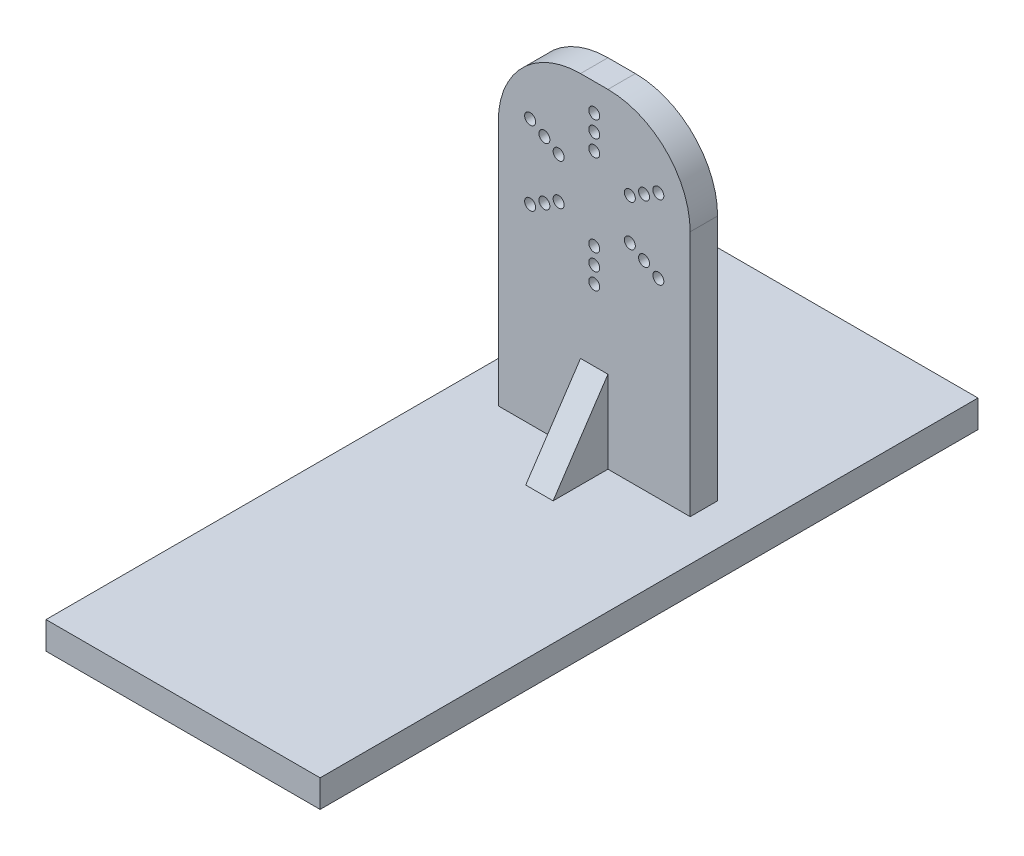
ISO-10303-21;
HEADER;
FILE_DESCRIPTION(('STEP AP214'),'2;1');
FILE_NAME('part.step','',(''),(''),'','','');
FILE_SCHEMA(('AUTOMOTIVE_DESIGN { 1 0 10303 214 1 1 1 1 }'));
ENDSEC;
DATA;
#1=APPLICATION_CONTEXT('core data for automotive mechanical design processes');
#2=APPLICATION_PROTOCOL_DEFINITION('international standard','automotive_design',2000,#1);
#3=PRODUCT_CONTEXT('',#1,'mechanical');
#4=PRODUCT('Part','Part','',(#3));
#5=PRODUCT_RELATED_PRODUCT_CATEGORY('part','',(#4));
#6=PRODUCT_DEFINITION_FORMATION('','',#4);
#7=PRODUCT_DEFINITION_CONTEXT('part definition',#1,'design');
#8=PRODUCT_DEFINITION('design','',#6,#7);
#9=PRODUCT_DEFINITION_SHAPE('','',#8);
#10=(LENGTH_UNIT() NAMED_UNIT(*) SI_UNIT(.MILLI.,.METRE.));
#11=(NAMED_UNIT(*) PLANE_ANGLE_UNIT() SI_UNIT($,.RADIAN.));
#12=(NAMED_UNIT(*) SI_UNIT($,.STERADIAN.) SOLID_ANGLE_UNIT());
#13=UNCERTAINTY_MEASURE_WITH_UNIT(LENGTH_MEASURE(1.E-05),#10,'distance_accuracy_value','');
#14=(GEOMETRIC_REPRESENTATION_CONTEXT(3) GLOBAL_UNCERTAINTY_ASSIGNED_CONTEXT((#13)) GLOBAL_UNIT_ASSIGNED_CONTEXT((#10,
#11,#12)) REPRESENTATION_CONTEXT('',''));
#15=CARTESIAN_POINT('',(0.,0.,0.));
#16=DIRECTION('',(0.,0.,1.));
#17=DIRECTION('',(1.,0.,0.));
#18=AXIS2_PLACEMENT_3D('',#15,#16,#17);
#19=CARTESIAN_POINT('',(17.5,-30.,2.5));
#20=DIRECTION('',(-1.,0.,0.));
#21=DIRECTION('',(0.,0.,1.));
#22=AXIS2_PLACEMENT_3D('',#19,#20,#21);
#23=PLANE('',#22);
#24=DIRECTION('',(0.,1.,0.));
#25=VECTOR('',#24,1.);
#26=CARTESIAN_POINT('',(17.5,-30.,-2.5));
#27=LINE('',#26,#25);
#28=CARTESIAN_POINT('',(17.5,-30.,-2.5));
#29=VERTEX_POINT('',#28);
#30=CARTESIAN_POINT('',(17.5,15.,-2.5));
#31=VERTEX_POINT('',#30);
#32=EDGE_CURVE('E181',#29,#31,#27,.T.);
#33=ORIENTED_EDGE('',*,*,#32,.T.);
#34=DIRECTION('',(0.,0.,-1.));
#35=VECTOR('',#34,1.);
#36=CARTESIAN_POINT('',(17.5,15.,2.5));
#37=LINE('',#36,#35);
#38=CARTESIAN_POINT('',(17.5,15.,2.5));
#39=VERTEX_POINT('',#38);
#40=EDGE_CURVE('E433',#31,#39,#37,.F.);
#41=ORIENTED_EDGE('',*,*,#40,.T.);
#42=DIRECTION('',(0.,1.,0.));
#43=VECTOR('',#42,1.);
#44=CARTESIAN_POINT('',(17.5,-30.,2.5));
#45=LINE('',#44,#43);
#46=CARTESIAN_POINT('',(17.5,-30.,2.5));
#47=VERTEX_POINT('',#46);
#48=EDGE_CURVE('E387',#47,#39,#45,.T.);
#49=ORIENTED_EDGE('',*,*,#48,.F.);
#50=DIRECTION('',(0.,0.,-1.));
#51=VECTOR('',#50,1.);
#52=CARTESIAN_POINT('',(17.5,-30.,2.5));
#53=LINE('',#52,#51);
#54=EDGE_CURVE('E404',#47,#29,#53,.T.);
#55=ORIENTED_EDGE('',*,*,#54,.T.);
#56=EDGE_LOOP('',(#33,#41,#49,#55));
#57=FACE_BOUND('',#56,.T.);
#58=ADVANCED_FACE('F39',(#57),#23,.F.);
#59=CARTESIAN_POINT('',(-17.5,30.,2.5));
#60=DIRECTION('',(0.,-1.,0.));
#61=DIRECTION('',(0.,0.,-1.));
#62=AXIS2_PLACEMENT_3D('',#59,#60,#61);
#63=PLANE('',#62);
#64=DIRECTION('',(-1.,0.,0.));
#65=VECTOR('',#64,1.);
#66=CARTESIAN_POINT('',(-17.5,30.,2.5));
#67=LINE('',#66,#65);
#68=CARTESIAN_POINT('',(2.5,30.,2.5));
#69=VERTEX_POINT('',#68);
#70=CARTESIAN_POINT('',(-2.50000000000001,30.,2.5));
#71=VERTEX_POINT('',#70);
#72=EDGE_CURVE('E391',#69,#71,#67,.T.);
#73=ORIENTED_EDGE('',*,*,#72,.F.);
#74=DIRECTION('',(0.,0.,-1.));
#75=VECTOR('',#74,1.);
#76=CARTESIAN_POINT('',(2.5,30.,2.5));
#77=LINE('',#76,#75);
#78=CARTESIAN_POINT('',(2.5,30.,-2.5));
#79=VERTEX_POINT('',#78);
#80=EDGE_CURVE('E423',#69,#79,#77,.T.);
#81=ORIENTED_EDGE('',*,*,#80,.T.);
#82=DIRECTION('',(-1.,0.,0.));
#83=VECTOR('',#82,1.);
#84=CARTESIAN_POINT('',(-17.5,30.,-2.5));
#85=LINE('',#84,#83);
#86=CARTESIAN_POINT('',(-2.50000000000001,30.,-2.5));
#87=VERTEX_POINT('',#86);
#88=EDGE_CURVE('E407',#79,#87,#85,.T.);
#89=ORIENTED_EDGE('',*,*,#88,.T.);
#90=DIRECTION('',(0.,0.,-1.));
#91=VECTOR('',#90,1.);
#92=CARTESIAN_POINT('',(-2.50000000000001,30.,2.5));
#93=LINE('',#92,#91);
#94=EDGE_CURVE('E420',#87,#71,#93,.F.);
#95=ORIENTED_EDGE('',*,*,#94,.T.);
#96=EDGE_LOOP('',(#73,#81,#89,#95));
#97=FACE_BOUND('',#96,.T.);
#98=ADVANCED_FACE('F450',(#97),#63,.F.);
#99=CARTESIAN_POINT('',(-17.5,-30.,2.5));
#100=DIRECTION('',(1.,0.,0.));
#101=DIRECTION('',(0.,0.,-1.));
#102=AXIS2_PLACEMENT_3D('',#99,#100,#101);
#103=PLANE('',#102);
#104=DIRECTION('',(0.,-1.,0.));
#105=VECTOR('',#104,1.);
#106=CARTESIAN_POINT('',(-17.5,-30.,2.5));
#107=LINE('',#106,#105);
#108=CARTESIAN_POINT('',(-17.5,15.,2.5));
#109=VERTEX_POINT('',#108);
#110=CARTESIAN_POINT('',(-17.5,-30.,2.5));
#111=VERTEX_POINT('',#110);
#112=EDGE_CURVE('E396',#109,#111,#107,.T.);
#113=ORIENTED_EDGE('',*,*,#112,.F.);
#114=DIRECTION('',(0.,0.,-1.));
#115=VECTOR('',#114,1.);
#116=CARTESIAN_POINT('',(-17.5,15.,2.5));
#117=LINE('',#116,#115);
#118=CARTESIAN_POINT('',(-17.5,15.,-2.5));
#119=VERTEX_POINT('',#118);
#120=EDGE_CURVE('E43',#109,#119,#117,.T.);
#121=ORIENTED_EDGE('',*,*,#120,.T.);
#122=DIRECTION('',(0.,-1.,0.));
#123=VECTOR('',#122,1.);
#124=CARTESIAN_POINT('',(-17.5,-30.,-2.5));
#125=LINE('',#124,#123);
#126=CARTESIAN_POINT('',(-17.5,-30.,-2.5));
#127=VERTEX_POINT('',#126);
#128=EDGE_CURVE('E392',#119,#127,#125,.T.);
#129=ORIENTED_EDGE('',*,*,#128,.T.);
#130=DIRECTION('',(0.,0.,-1.));
#131=VECTOR('',#130,1.);
#132=CARTESIAN_POINT('',(-17.5,-30.,2.5));
#133=LINE('',#132,#131);
#134=EDGE_CURVE('E416',#111,#127,#133,.T.);
#135=ORIENTED_EDGE('',*,*,#134,.F.);
#136=EDGE_LOOP('',(#113,#121,#129,#135));
#137=FACE_BOUND('',#136,.T.);
#138=ADVANCED_FACE('F493',(#137),#103,.F.);
#139=CARTESIAN_POINT('',(0.,0.,2.5));
#140=DIRECTION('',(0.,0.,-1.));
#141=DIRECTION('',(-1.,0.,0.));
#142=AXIS2_PLACEMENT_3D('',#139,#140,#141);
#143=PLANE('',#142);
#144=CARTESIAN_POINT('',(0.,25.,2.5));
#145=DIRECTION('',(0.,0.,-1.));
#146=DIRECTION('',(-1.,0.,0.));
#147=AXIS2_PLACEMENT_3D('',#144,#145,#146);
#148=CIRCLE('',#147,1.);
#149=CARTESIAN_POINT('',(-0.999999999999929,25.,2.5));
#150=VERTEX_POINT('',#149);
#151=EDGE_CURVE('E248',#150,#150,#148,.F.);
#152=ORIENTED_EDGE('',*,*,#151,.F.);
#153=EDGE_LOOP('',(#152));
#154=FACE_BOUND('',#153,.T.);
#155=CARTESIAN_POINT('',(6.49519052838326,15.25,2.5));
#156=DIRECTION('',(0.,0.,-1.));
#157=DIRECTION('',(-1.,0.,0.));
#158=AXIS2_PLACEMENT_3D('',#155,#156,#157);
#159=CIRCLE('',#158,1.);
#160=CARTESIAN_POINT('',(5.49519052838326,15.25,2.5));
#161=VERTEX_POINT('',#160);
#162=EDGE_CURVE('E256',#161,#161,#159,.F.);
#163=ORIENTED_EDGE('',*,*,#162,.F.);
#164=EDGE_LOOP('',(#163));
#165=FACE_BOUND('',#164,.T.);
#166=CARTESIAN_POINT('',(-6.49519052838332,15.2499999999999,2.5));
#167=DIRECTION('',(0.,0.,-1.));
#168=DIRECTION('',(-1.,0.,0.));
#169=AXIS2_PLACEMENT_3D('',#166,#167,#168);
#170=CIRCLE('',#169,1.);
#171=CARTESIAN_POINT('',(-7.49519052838332,15.2499999999999,2.5));
#172=VERTEX_POINT('',#171);
#173=EDGE_CURVE('E345',#172,#172,#170,.F.);
#174=ORIENTED_EDGE('',*,*,#173,.F.);
#175=EDGE_LOOP('',(#174));
#176=FACE_BOUND('',#175,.T.);
#177=CARTESIAN_POINT('',(-11.6913429510899,4.75,2.5));
#178=DIRECTION('',(0.,0.,-1.));
#179=DIRECTION('',(-1.,0.,0.));
#180=AXIS2_PLACEMENT_3D('',#177,#178,#179);
#181=CIRCLE('',#180,0.999999999999998);
#182=CARTESIAN_POINT('',(-12.6913429510899,4.75,2.5));
#183=VERTEX_POINT('',#182);
#184=EDGE_CURVE('E346',#183,#183,#181,.F.);
#185=ORIENTED_EDGE('',*,*,#184,.F.);
#186=EDGE_LOOP('',(#185));
#187=FACE_BOUND('',#186,.T.);
#188=CARTESIAN_POINT('',(-9.09326673973659,6.24999999999997,2.5));
#189=DIRECTION('',(0.,0.,-1.));
#190=DIRECTION('',(-1.,0.,0.));
#191=AXIS2_PLACEMENT_3D('',#188,#189,#190);
#192=CIRCLE('',#191,1.);
#193=CARTESIAN_POINT('',(-10.0932667397366,6.24999999999997,2.5));
#194=VERTEX_POINT('',#193);
#195=EDGE_CURVE('E329',#194,#194,#192,.F.);
#196=ORIENTED_EDGE('',*,*,#195,.F.);
#197=EDGE_LOOP('',(#196));
#198=FACE_BOUND('',#197,.T.);
#199=CARTESIAN_POINT('',(-6.49519052838326,7.74999999999994,2.5));
#200=DIRECTION('',(0.,0.,-1.));
#201=DIRECTION('',(-1.,0.,0.));
#202=AXIS2_PLACEMENT_3D('',#199,#200,#201);
#203=CIRCLE('',#202,1.);
#204=CARTESIAN_POINT('',(-7.49519052838326,7.74999999999994,2.5));
#205=VERTEX_POINT('',#204);
#206=EDGE_CURVE('E330',#205,#205,#203,.F.);
#207=ORIENTED_EDGE('',*,*,#206,.F.);
#208=EDGE_LOOP('',(#207));
#209=FACE_BOUND('',#208,.T.);
#210=CARTESIAN_POINT('',(-9.09326673973663,16.75,2.5));
#211=DIRECTION('',(0.,0.,-1.));
#212=DIRECTION('',(-1.,0.,0.));
#213=AXIS2_PLACEMENT_3D('',#210,#211,#212);
#214=CIRCLE('',#213,1.);
#215=CARTESIAN_POINT('',(-10.0932667397366,16.75,2.5));
#216=VERTEX_POINT('',#215);
#217=EDGE_CURVE('E377',#216,#216,#214,.F.);
#218=ORIENTED_EDGE('',*,*,#217,.F.);
#219=EDGE_LOOP('',(#218));
#220=FACE_BOUND('',#219,.T.);
#221=CARTESIAN_POINT('',(-11.6913429510899,18.25,2.5));
#222=DIRECTION('',(0.,0.,-1.));
#223=DIRECTION('',(-1.,0.,0.));
#224=AXIS2_PLACEMENT_3D('',#221,#222,#223);
#225=CIRCLE('',#224,1.);
#226=CARTESIAN_POINT('',(-12.6913429510899,18.25,2.5));
#227=VERTEX_POINT('',#226);
#228=EDGE_CURVE('E369',#227,#227,#225,.F.);
#229=ORIENTED_EDGE('',*,*,#228,.F.);
#230=EDGE_LOOP('',(#229));
#231=FACE_BOUND('',#230,.T.);
#232=CARTESIAN_POINT('',(0.,19.,2.5));
#233=DIRECTION('',(0.,0.,-1.));
#234=DIRECTION('',(-1.,0.,0.));
#235=AXIS2_PLACEMENT_3D('',#232,#233,#234);
#236=CIRCLE('',#235,1.);
#237=CARTESIAN_POINT('',(-1.00000000000006,19.,2.5));
#238=VERTEX_POINT('',#237);
#239=EDGE_CURVE('E361',#238,#238,#236,.F.);
#240=ORIENTED_EDGE('',*,*,#239,.F.);
#241=EDGE_LOOP('',(#240));
#242=FACE_BOUND('',#241,.T.);
#243=CARTESIAN_POINT('',(0.,22.,2.5));
#244=DIRECTION('',(0.,0.,-1.));
#245=DIRECTION('',(-1.,0.,0.));
#246=AXIS2_PLACEMENT_3D('',#243,#244,#245);
#247=CIRCLE('',#246,1.);
#248=CARTESIAN_POINT('',(-1.00000000000003,22.,2.5));
#249=VERTEX_POINT('',#248);
#250=EDGE_CURVE('E249',#249,#249,#247,.F.);
#251=ORIENTED_EDGE('',*,*,#250,.F.);
#252=EDGE_LOOP('',(#251));
#253=FACE_BOUND('',#252,.T.);
#254=CARTESIAN_POINT('',(9.0932667397366,16.75,2.5));
#255=DIRECTION('',(0.,0.,-1.));
#256=DIRECTION('',(-1.,0.,0.));
#257=AXIS2_PLACEMENT_3D('',#254,#255,#256);
#258=CIRCLE('',#257,1.);
#259=CARTESIAN_POINT('',(8.09326673973659,16.75,2.5));
#260=VERTEX_POINT('',#259);
#261=EDGE_CURVE('E283',#260,#260,#258,.F.);
#262=ORIENTED_EDGE('',*,*,#261,.F.);
#263=EDGE_LOOP('',(#262));
#264=FACE_BOUND('',#263,.T.);
#265=CARTESIAN_POINT('',(11.6913429510899,18.25,2.5));
#266=DIRECTION('',(0.,0.,-1.));
#267=DIRECTION('',(-1.,0.,0.));
#268=AXIS2_PLACEMENT_3D('',#265,#266,#267);
#269=CIRCLE('',#268,1.);
#270=CARTESIAN_POINT('',(10.6913429510899,18.25,2.5));
#271=VERTEX_POINT('',#270);
#272=EDGE_CURVE('E275',#271,#271,#269,.F.);
#273=ORIENTED_EDGE('',*,*,#272,.F.);
#274=EDGE_LOOP('',(#273));
#275=FACE_BOUND('',#274,.T.);
#276=CARTESIAN_POINT('',(6.49519052838332,7.75000000000005,2.5));
#277=DIRECTION('',(0.,0.,-1.));
#278=DIRECTION('',(-1.,0.,0.));
#279=AXIS2_PLACEMENT_3D('',#276,#277,#278);
#280=CIRCLE('',#279,1.);
#281=CARTESIAN_POINT('',(5.49519052838332,7.75000000000005,2.5));
#282=VERTEX_POINT('',#281);
#283=EDGE_CURVE('E266',#282,#282,#280,.F.);
#284=ORIENTED_EDGE('',*,*,#283,.F.);
#285=EDGE_LOOP('',(#284));
#286=FACE_BOUND('',#285,.T.);
#287=CARTESIAN_POINT('',(9.09326673973662,6.25000000000002,2.5));
#288=DIRECTION('',(0.,0.,-1.));
#289=DIRECTION('',(-1.,0.,0.));
#290=AXIS2_PLACEMENT_3D('',#287,#288,#289);
#291=CIRCLE('',#290,1.);
#292=CARTESIAN_POINT('',(8.09326673973662,6.25000000000002,2.5));
#293=VERTEX_POINT('',#292);
#294=EDGE_CURVE('E265',#293,#293,#291,.F.);
#295=ORIENTED_EDGE('',*,*,#294,.F.);
#296=EDGE_LOOP('',(#295));
#297=FACE_BOUND('',#296,.T.);
#298=CARTESIAN_POINT('',(11.6913429510899,4.74999999999999,2.5));
#299=DIRECTION('',(0.,0.,-1.));
#300=DIRECTION('',(-1.,0.,0.));
#301=AXIS2_PLACEMENT_3D('',#298,#299,#300);
#302=CIRCLE('',#301,1.);
#303=CARTESIAN_POINT('',(10.6913429510899,4.74999999999999,2.5));
#304=VERTEX_POINT('',#303);
#305=EDGE_CURVE('E315',#304,#304,#302,.F.);
#306=ORIENTED_EDGE('',*,*,#305,.F.);
#307=EDGE_LOOP('',(#306));
#308=FACE_BOUND('',#307,.T.);
#309=CARTESIAN_POINT('',(0.,4.,2.5));
#310=DIRECTION('',(0.,0.,-1.));
#311=DIRECTION('',(-1.,0.,0.));
#312=AXIS2_PLACEMENT_3D('',#309,#310,#311);
#313=CIRCLE('',#312,1.);
#314=CARTESIAN_POINT('',(-0.999999999999938,4.,2.5));
#315=VERTEX_POINT('',#314);
#316=EDGE_CURVE('E307',#315,#315,#313,.F.);
#317=ORIENTED_EDGE('',*,*,#316,.F.);
#318=EDGE_LOOP('',(#317));
#319=FACE_BOUND('',#318,.T.);
#320=CARTESIAN_POINT('',(0.,0.999999999999994,2.5));
#321=DIRECTION('',(0.,0.,-1.));
#322=DIRECTION('',(-1.,0.,0.));
#323=AXIS2_PLACEMENT_3D('',#320,#321,#322);
#324=CIRCLE('',#323,1.);
#325=CARTESIAN_POINT('',(-0.99999999999997,0.999999999999994,2.5));
#326=VERTEX_POINT('',#325);
#327=EDGE_CURVE('E298',#326,#326,#324,.F.);
#328=ORIENTED_EDGE('',*,*,#327,.F.);
#329=EDGE_LOOP('',(#328));
#330=FACE_BOUND('',#329,.T.);
#331=CARTESIAN_POINT('',(0.,-2.00000000000001,2.5));
#332=DIRECTION('',(0.,0.,-1.));
#333=DIRECTION('',(-1.,0.,0.));
#334=AXIS2_PLACEMENT_3D('',#331,#332,#333);
#335=CIRCLE('',#334,1.);
#336=CARTESIAN_POINT('',(-1.,-2.00000000000001,2.5));
#337=VERTEX_POINT('',#336);
#338=EDGE_CURVE('E297',#337,#337,#335,.F.);
#339=ORIENTED_EDGE('',*,*,#338,.F.);
#340=EDGE_LOOP('',(#339));
#341=FACE_BOUND('',#340,.T.);
#342=DIRECTION('',(-1.,0.,0.));
#343=VECTOR('',#342,1.);
#344=CARTESIAN_POINT('',(2.5,-15.,2.5));
#345=LINE('',#344,#343);
#346=CARTESIAN_POINT('',(2.5,-15.,2.5));
#347=VERTEX_POINT('',#346);
#348=CARTESIAN_POINT('',(-2.5,-15.,2.5));
#349=VERTEX_POINT('',#348);
#350=EDGE_CURVE('E199',#347,#349,#345,.T.);
#351=ORIENTED_EDGE('',*,*,#350,.F.);
#352=DIRECTION('',(0.,1.,0.));
#353=VECTOR('',#352,1.);
#354=CARTESIAN_POINT('',(2.5,-30.,2.5));
#355=LINE('',#354,#353);
#356=CARTESIAN_POINT('',(2.5,-30.,2.5));
#357=VERTEX_POINT('',#356);
#358=EDGE_CURVE('E196',#357,#347,#355,.T.);
#359=ORIENTED_EDGE('',*,*,#358,.F.);
#360=DIRECTION('',(1.,0.,0.));
#361=VECTOR('',#360,1.);
#362=CARTESIAN_POINT('',(-17.5,-30.,2.5));
#363=LINE('',#362,#361);
#364=EDGE_CURVE('E399',#357,#47,#363,.T.);
#365=ORIENTED_EDGE('',*,*,#364,.T.);
#366=ORIENTED_EDGE('',*,*,#48,.T.);
#367=CARTESIAN_POINT('',(2.5,15.,2.5));
#368=DIRECTION('',(0.,0.,-1.));
#369=DIRECTION('',(-1.,0.,0.));
#370=AXIS2_PLACEMENT_3D('',#367,#368,#369);
#371=CIRCLE('',#370,15.);
#372=EDGE_CURVE('E185',#39,#69,#371,.F.);
#373=ORIENTED_EDGE('',*,*,#372,.T.);
#374=ORIENTED_EDGE('',*,*,#72,.T.);
#375=CARTESIAN_POINT('',(-2.50000000000001,15.,2.5));
#376=DIRECTION('',(0.,0.,-1.));
#377=DIRECTION('',(-1.,0.,0.));
#378=AXIS2_PLACEMENT_3D('',#375,#376,#377);
#379=CIRCLE('',#378,15.);
#380=EDGE_CURVE('E436',#71,#109,#379,.F.);
#381=ORIENTED_EDGE('',*,*,#380,.T.);
#382=ORIENTED_EDGE('',*,*,#112,.T.);
#383=CARTESIAN_POINT('',(-2.5,-30.,2.5));
#384=VERTEX_POINT('',#383);
#385=EDGE_CURVE('E400',#111,#384,#363,.T.);
#386=ORIENTED_EDGE('',*,*,#385,.T.);
#387=DIRECTION('',(0.,1.,0.));
#388=VECTOR('',#387,1.);
#389=CARTESIAN_POINT('',(-2.5,-30.,2.5));
#390=LINE('',#389,#388);
#391=EDGE_CURVE('E65',#384,#349,#390,.T.);
#392=ORIENTED_EDGE('',*,*,#391,.T.);
#393=EDGE_LOOP('',(#351,#359,#365,#366,#373,#374,#381,#382,#386,#392));
#394=FACE_BOUND('',#393,.T.);
#395=ADVANCED_FACE('F443',(#154,#165,#176,#187,#198,#209,#220,#231,#242,#253,#264,#275,#286,
#297,#308,#319,#330,#341,#394),#143,.F.);
#396=CARTESIAN_POINT('',(0.,0.,-2.5));
#397=DIRECTION('',(0.,0.,-1.));
#398=DIRECTION('',(-1.,0.,0.));
#399=AXIS2_PLACEMENT_3D('',#396,#397,#398);
#400=PLANE('',#399);
#401=DIRECTION('',(0.,-1.,0.));
#402=VECTOR('',#401,1.);
#403=CARTESIAN_POINT('',(1.5,-20.,-2.5));
#404=LINE('',#403,#402);
#405=CARTESIAN_POINT('',(1.5,-20.,-2.5));
#406=VERTEX_POINT('',#405);
#407=CARTESIAN_POINT('',(1.5,-30.,-2.5));
#408=VERTEX_POINT('',#407);
#409=EDGE_CURVE('E155',#406,#408,#404,.T.);
#410=ORIENTED_EDGE('',*,*,#409,.F.);
#411=DIRECTION('',(-1.,0.,0.));
#412=VECTOR('',#411,1.);
#413=CARTESIAN_POINT('',(1.5,-20.,-2.5));
#414=LINE('',#413,#412);
#415=CARTESIAN_POINT('',(-1.5,-20.,-2.5));
#416=VERTEX_POINT('',#415);
#417=EDGE_CURVE('E474',#406,#416,#414,.T.);
#418=ORIENTED_EDGE('',*,*,#417,.T.);
#419=DIRECTION('',(0.,-1.,0.));
#420=VECTOR('',#419,1.);
#421=CARTESIAN_POINT('',(-1.5,-20.,-2.5));
#422=LINE('',#421,#420);
#423=CARTESIAN_POINT('',(-1.5,-30.,-2.5));
#424=VERTEX_POINT('',#423);
#425=EDGE_CURVE('E484',#416,#424,#422,.T.);
#426=ORIENTED_EDGE('',*,*,#425,.T.);
#427=DIRECTION('',(1.,0.,0.));
#428=VECTOR('',#427,1.);
#429=CARTESIAN_POINT('',(25.,-30.,-2.5));
#430=LINE('',#429,#428);
#431=EDGE_CURVE('E11',#127,#424,#430,.T.);
#432=ORIENTED_EDGE('',*,*,#431,.F.);
#433=ORIENTED_EDGE('',*,*,#128,.F.);
#434=CARTESIAN_POINT('',(-2.50000000000001,15.,-2.5));
#435=DIRECTION('',(0.,0.,-1.));
#436=DIRECTION('',(-1.,0.,0.));
#437=AXIS2_PLACEMENT_3D('',#434,#435,#436);
#438=CIRCLE('',#437,15.);
#439=EDGE_CURVE('E427',#119,#87,#438,.T.);
#440=ORIENTED_EDGE('',*,*,#439,.T.);
#441=ORIENTED_EDGE('',*,*,#88,.F.);
#442=CARTESIAN_POINT('',(2.5,15.,-2.5));
#443=DIRECTION('',(0.,0.,-1.));
#444=DIRECTION('',(-1.,0.,0.));
#445=AXIS2_PLACEMENT_3D('',#442,#443,#444);
#446=CIRCLE('',#445,15.);
#447=EDGE_CURVE('E430',#79,#31,#446,.T.);
#448=ORIENTED_EDGE('',*,*,#447,.T.);
#449=ORIENTED_EDGE('',*,*,#32,.F.);
#450=EDGE_CURVE('E49',#408,#29,#430,.T.);
#451=ORIENTED_EDGE('',*,*,#450,.F.);
#452=EDGE_LOOP('',(#410,#418,#426,#432,#433,#440,#441,#448,#449,#451));
#453=FACE_BOUND('',#452,.T.);
#454=CARTESIAN_POINT('',(0.,25.,-2.5));
#455=DIRECTION('',(0.,0.,-1.));
#456=DIRECTION('',(-1.,0.,0.));
#457=AXIS2_PLACEMENT_3D('',#454,#455,#456);
#458=CIRCLE('',#457,1.);
#459=CARTESIAN_POINT('',(-0.999999999999929,25.,-2.5));
#460=VERTEX_POINT('',#459);
#461=EDGE_CURVE('E244',#460,#460,#458,.T.);
#462=ORIENTED_EDGE('',*,*,#461,.F.);
#463=EDGE_LOOP('',(#462));
#464=FACE_BOUND('',#463,.T.);
#465=CARTESIAN_POINT('',(6.49519052838326,15.25,-2.5));
#466=DIRECTION('',(0.,0.,-1.));
#467=DIRECTION('',(-1.,0.,0.));
#468=AXIS2_PLACEMENT_3D('',#465,#466,#467);
#469=CIRCLE('',#468,1.);
#470=CARTESIAN_POINT('',(5.49519052838326,15.25,-2.5));
#471=VERTEX_POINT('',#470);
#472=EDGE_CURVE('E235',#471,#471,#469,.T.);
#473=ORIENTED_EDGE('',*,*,#472,.F.);
#474=EDGE_LOOP('',(#473));
#475=FACE_BOUND('',#474,.T.);
#476=CARTESIAN_POINT('',(-6.49519052838332,15.2499999999999,-2.5));
#477=DIRECTION('',(0.,0.,-1.));
#478=DIRECTION('',(-1.,0.,0.));
#479=AXIS2_PLACEMENT_3D('',#476,#477,#478);
#480=CIRCLE('',#479,1.);
#481=CARTESIAN_POINT('',(-7.49519052838332,15.2499999999999,-2.5));
#482=VERTEX_POINT('',#481);
#483=EDGE_CURVE('E341',#482,#482,#480,.T.);
#484=ORIENTED_EDGE('',*,*,#483,.F.);
#485=EDGE_LOOP('',(#484));
#486=FACE_BOUND('',#485,.T.);
#487=CARTESIAN_POINT('',(-11.6913429510899,4.75,-2.5));
#488=DIRECTION('',(0.,0.,-1.));
#489=DIRECTION('',(-1.,0.,0.));
#490=AXIS2_PLACEMENT_3D('',#487,#488,#489);
#491=CIRCLE('',#490,0.999999999999998);
#492=CARTESIAN_POINT('',(-12.6913429510899,4.75,-2.5));
#493=VERTEX_POINT('',#492);
#494=EDGE_CURVE('E334',#493,#493,#491,.T.);
#495=ORIENTED_EDGE('',*,*,#494,.F.);
#496=EDGE_LOOP('',(#495));
#497=FACE_BOUND('',#496,.T.);
#498=CARTESIAN_POINT('',(-9.09326673973659,6.24999999999997,-2.5));
#499=DIRECTION('',(0.,0.,-1.));
#500=DIRECTION('',(-1.,0.,0.));
#501=AXIS2_PLACEMENT_3D('',#498,#499,#500);
#502=CIRCLE('',#501,1.);
#503=CARTESIAN_POINT('',(-10.0932667397366,6.24999999999997,-2.5));
#504=VERTEX_POINT('',#503);
#505=EDGE_CURVE('E325',#504,#504,#502,.T.);
#506=ORIENTED_EDGE('',*,*,#505,.F.);
#507=EDGE_LOOP('',(#506));
#508=FACE_BOUND('',#507,.T.);
#509=CARTESIAN_POINT('',(-6.49519052838326,7.74999999999994,-2.5));
#510=DIRECTION('',(0.,0.,-1.));
#511=DIRECTION('',(-1.,0.,0.));
#512=AXIS2_PLACEMENT_3D('',#509,#510,#511);
#513=CIRCLE('',#512,1.);
#514=CARTESIAN_POINT('',(-7.49519052838326,7.74999999999994,-2.5));
#515=VERTEX_POINT('',#514);
#516=EDGE_CURVE('E302',#515,#515,#513,.T.);
#517=ORIENTED_EDGE('',*,*,#516,.F.);
#518=EDGE_LOOP('',(#517));
#519=FACE_BOUND('',#518,.T.);
#520=CARTESIAN_POINT('',(-9.09326673973663,16.75,-2.5));
#521=DIRECTION('',(0.,0.,-1.));
#522=DIRECTION('',(-1.,0.,0.));
#523=AXIS2_PLACEMENT_3D('',#520,#521,#522);
#524=CIRCLE('',#523,1.);
#525=CARTESIAN_POINT('',(-10.0932667397366,16.75,-2.5));
#526=VERTEX_POINT('',#525);
#527=EDGE_CURVE('E350',#526,#526,#524,.T.);
#528=ORIENTED_EDGE('',*,*,#527,.F.);
#529=EDGE_LOOP('',(#528));
#530=FACE_BOUND('',#529,.T.);
#531=CARTESIAN_POINT('',(-11.6913429510899,18.25,-2.5));
#532=DIRECTION('',(0.,0.,-1.));
#533=DIRECTION('',(-1.,0.,0.));
#534=AXIS2_PLACEMENT_3D('',#531,#532,#533);
#535=CIRCLE('',#534,1.);
#536=CARTESIAN_POINT('',(-12.6913429510899,18.25,-2.5));
#537=VERTEX_POINT('',#536);
#538=EDGE_CURVE('E373',#537,#537,#535,.T.);
#539=ORIENTED_EDGE('',*,*,#538,.F.);
#540=EDGE_LOOP('',(#539));
#541=FACE_BOUND('',#540,.T.);
#542=CARTESIAN_POINT('',(0.,19.,-2.5));
#543=DIRECTION('',(0.,0.,-1.));
#544=DIRECTION('',(-1.,0.,0.));
#545=AXIS2_PLACEMENT_3D('',#542,#543,#544);
#546=CIRCLE('',#545,1.);
#547=CARTESIAN_POINT('',(-1.00000000000006,19.,-2.5));
#548=VERTEX_POINT('',#547);
#549=EDGE_CURVE('E365',#548,#548,#546,.T.);
#550=ORIENTED_EDGE('',*,*,#549,.F.);
#551=EDGE_LOOP('',(#550));
#552=FACE_BOUND('',#551,.T.);
#553=CARTESIAN_POINT('',(0.,22.,-2.5));
#554=DIRECTION('',(0.,0.,-1.));
#555=DIRECTION('',(-1.,0.,0.));
#556=AXIS2_PLACEMENT_3D('',#553,#554,#555);
#557=CIRCLE('',#556,1.);
#558=CARTESIAN_POINT('',(-1.00000000000003,22.,-2.5));
#559=VERTEX_POINT('',#558);
#560=EDGE_CURVE('E357',#559,#559,#557,.T.);
#561=ORIENTED_EDGE('',*,*,#560,.F.);
#562=EDGE_LOOP('',(#561));
#563=FACE_BOUND('',#562,.T.);
#564=CARTESIAN_POINT('',(9.0932667397366,16.75,-2.5));
#565=DIRECTION('',(0.,0.,-1.));
#566=DIRECTION('',(-1.,0.,0.));
#567=AXIS2_PLACEMENT_3D('',#564,#565,#566);
#568=CIRCLE('',#567,1.);
#569=CARTESIAN_POINT('',(8.09326673973659,16.75,-2.5));
#570=VERTEX_POINT('',#569);
#571=EDGE_CURVE('E260',#570,#570,#568,.T.);
#572=ORIENTED_EDGE('',*,*,#571,.F.);
#573=EDGE_LOOP('',(#572));
#574=FACE_BOUND('',#573,.T.);
#575=CARTESIAN_POINT('',(11.6913429510899,18.25,-2.5));
#576=DIRECTION('',(0.,0.,-1.));
#577=DIRECTION('',(-1.,0.,0.));
#578=AXIS2_PLACEMENT_3D('',#575,#576,#577);
#579=CIRCLE('',#578,1.);
#580=CARTESIAN_POINT('',(10.6913429510899,18.25,-2.5));
#581=VERTEX_POINT('',#580);
#582=EDGE_CURVE('E279',#581,#581,#579,.T.);
#583=ORIENTED_EDGE('',*,*,#582,.F.);
#584=EDGE_LOOP('',(#583));
#585=FACE_BOUND('',#584,.T.);
#586=CARTESIAN_POINT('',(6.49519052838332,7.75000000000005,-2.5));
#587=DIRECTION('',(0.,0.,-1.));
#588=DIRECTION('',(-1.,0.,0.));
#589=AXIS2_PLACEMENT_3D('',#586,#587,#588);
#590=CIRCLE('',#589,1.);
#591=CARTESIAN_POINT('',(5.49519052838332,7.75000000000005,-2.5));
#592=VERTEX_POINT('',#591);
#593=EDGE_CURVE('E271',#592,#592,#590,.T.);
#594=ORIENTED_EDGE('',*,*,#593,.F.);
#595=EDGE_LOOP('',(#594));
#596=FACE_BOUND('',#595,.T.);
#597=CARTESIAN_POINT('',(9.09326673973662,6.25000000000002,-2.5));
#598=DIRECTION('',(0.,0.,-1.));
#599=DIRECTION('',(-1.,0.,0.));
#600=AXIS2_PLACEMENT_3D('',#597,#598,#599);
#601=CIRCLE('',#600,1.);
#602=CARTESIAN_POINT('',(8.09326673973662,6.25000000000002,-2.5));
#603=VERTEX_POINT('',#602);
#604=EDGE_CURVE('E261',#603,#603,#601,.T.);
#605=ORIENTED_EDGE('',*,*,#604,.F.);
#606=EDGE_LOOP('',(#605));
#607=FACE_BOUND('',#606,.T.);
#608=CARTESIAN_POINT('',(11.6913429510899,4.74999999999999,-2.5));
#609=DIRECTION('',(0.,0.,-1.));
#610=DIRECTION('',(-1.,0.,0.));
#611=AXIS2_PLACEMENT_3D('',#608,#609,#610);
#612=CIRCLE('',#611,1.);
#613=CARTESIAN_POINT('',(10.6913429510899,4.74999999999999,-2.5));
#614=VERTEX_POINT('',#613);
#615=EDGE_CURVE('E270',#614,#614,#612,.T.);
#616=ORIENTED_EDGE('',*,*,#615,.F.);
#617=EDGE_LOOP('',(#616));
#618=FACE_BOUND('',#617,.T.);
#619=CARTESIAN_POINT('',(0.,4.,-2.5));
#620=DIRECTION('',(0.,0.,-1.));
#621=DIRECTION('',(-1.,0.,0.));
#622=AXIS2_PLACEMENT_3D('',#619,#620,#621);
#623=CIRCLE('',#622,1.);
#624=CARTESIAN_POINT('',(-0.999999999999939,4.,-2.5));
#625=VERTEX_POINT('',#624);
#626=EDGE_CURVE('E311',#625,#625,#623,.T.);
#627=ORIENTED_EDGE('',*,*,#626,.F.);
#628=EDGE_LOOP('',(#627));
#629=FACE_BOUND('',#628,.T.);
#630=CARTESIAN_POINT('',(0.,0.999999999999994,-2.5));
#631=DIRECTION('',(0.,0.,-1.));
#632=DIRECTION('',(-1.,0.,0.));
#633=AXIS2_PLACEMENT_3D('',#630,#631,#632);
#634=CIRCLE('',#633,1.);
#635=CARTESIAN_POINT('',(-0.999999999999971,0.999999999999994,-2.5));
#636=VERTEX_POINT('',#635);
#637=EDGE_CURVE('E303',#636,#636,#634,.T.);
#638=ORIENTED_EDGE('',*,*,#637,.F.);
#639=EDGE_LOOP('',(#638));
#640=FACE_BOUND('',#639,.T.);
#641=CARTESIAN_POINT('',(0.,-2.00000000000001,-2.5));
#642=DIRECTION('',(0.,0.,-1.));
#643=DIRECTION('',(-1.,0.,0.));
#644=AXIS2_PLACEMENT_3D('',#641,#642,#643);
#645=CIRCLE('',#644,1.);
#646=CARTESIAN_POINT('',(-1.,-2.00000000000001,-2.5));
#647=VERTEX_POINT('',#646);
#648=EDGE_CURVE('E293',#647,#647,#645,.T.);
#649=ORIENTED_EDGE('',*,*,#648,.F.);
#650=EDGE_LOOP('',(#649));
#651=FACE_BOUND('',#650,.T.);
#652=ADVANCED_FACE('F178',(#453,#464,#475,#486,#497,#508,#519,#530,#541,#552,#563,#574,#585,
#596,#607,#618,#629,#640,#651),#400,.T.);
#653=CARTESIAN_POINT('',(0.,-2.00000000000001,5.3284271247462));
#654=DIRECTION('',(0.,0.,-1.));
#655=DIRECTION('',(-1.,0.,0.));
#656=AXIS2_PLACEMENT_3D('',#653,#654,#655);
#657=CYLINDRICAL_SURFACE('',#656,1.);
#658=ORIENTED_EDGE('',*,*,#338,.T.);
#659=EDGE_LOOP('',(#658));
#660=FACE_BOUND('',#659,.T.);
#661=ORIENTED_EDGE('',*,*,#648,.T.);
#662=EDGE_LOOP('',(#661));
#663=FACE_BOUND('',#662,.T.);
#664=ADVANCED_FACE('F560',(#660,#663),#657,.F.);
#665=CARTESIAN_POINT('',(0.,0.999999999999994,5.3284271247462));
#666=DIRECTION('',(0.,0.,-1.));
#667=DIRECTION('',(-1.,0.,0.));
#668=AXIS2_PLACEMENT_3D('',#665,#666,#667);
#669=CYLINDRICAL_SURFACE('',#668,1.);
#670=ORIENTED_EDGE('',*,*,#327,.T.);
#671=EDGE_LOOP('',(#670));
#672=FACE_BOUND('',#671,.T.);
#673=ORIENTED_EDGE('',*,*,#637,.T.);
#674=EDGE_LOOP('',(#673));
#675=FACE_BOUND('',#674,.T.);
#676=ADVANCED_FACE('F563',(#672,#675),#669,.F.);
#677=CARTESIAN_POINT('',(0.,4.,5.3284271247462));
#678=DIRECTION('',(0.,0.,-1.));
#679=DIRECTION('',(-1.,0.,0.));
#680=AXIS2_PLACEMENT_3D('',#677,#678,#679);
#681=CYLINDRICAL_SURFACE('',#680,1.);
#682=ORIENTED_EDGE('',*,*,#316,.T.);
#683=EDGE_LOOP('',(#682));
#684=FACE_BOUND('',#683,.T.);
#685=ORIENTED_EDGE('',*,*,#626,.T.);
#686=EDGE_LOOP('',(#685));
#687=FACE_BOUND('',#686,.T.);
#688=ADVANCED_FACE('F567',(#684,#687),#681,.F.);
#689=CARTESIAN_POINT('',(11.6913429510899,4.74999999999999,5.3284271247462));
#690=DIRECTION('',(0.,0.,-1.));
#691=DIRECTION('',(-1.,0.,0.));
#692=AXIS2_PLACEMENT_3D('',#689,#690,#691);
#693=CYLINDRICAL_SURFACE('',#692,1.);
#694=ORIENTED_EDGE('',*,*,#305,.T.);
#695=EDGE_LOOP('',(#694));
#696=FACE_BOUND('',#695,.T.);
#697=ORIENTED_EDGE('',*,*,#615,.T.);
#698=EDGE_LOOP('',(#697));
#699=FACE_BOUND('',#698,.T.);
#700=ADVANCED_FACE('F546',(#696,#699),#693,.F.);
#701=CARTESIAN_POINT('',(9.09326673973662,6.25000000000002,5.3284271247462));
#702=DIRECTION('',(0.,0.,-1.));
#703=DIRECTION('',(-1.,0.,0.));
#704=AXIS2_PLACEMENT_3D('',#701,#702,#703);
#705=CYLINDRICAL_SURFACE('',#704,1.);
#706=ORIENTED_EDGE('',*,*,#294,.T.);
#707=EDGE_LOOP('',(#706));
#708=FACE_BOUND('',#707,.T.);
#709=ORIENTED_EDGE('',*,*,#604,.T.);
#710=EDGE_LOOP('',(#709));
#711=FACE_BOUND('',#710,.T.);
#712=ADVANCED_FACE('F542',(#708,#711),#705,.F.);
#713=CARTESIAN_POINT('',(6.49519052838332,7.75000000000005,5.3284271247462));
#714=DIRECTION('',(0.,0.,-1.));
#715=DIRECTION('',(-1.,0.,0.));
#716=AXIS2_PLACEMENT_3D('',#713,#714,#715);
#717=CYLINDRICAL_SURFACE('',#716,1.);
#718=ORIENTED_EDGE('',*,*,#283,.T.);
#719=EDGE_LOOP('',(#718));
#720=FACE_BOUND('',#719,.T.);
#721=ORIENTED_EDGE('',*,*,#593,.T.);
#722=EDGE_LOOP('',(#721));
#723=FACE_BOUND('',#722,.T.);
#724=ADVANCED_FACE('F545',(#720,#723),#717,.F.);
#725=CARTESIAN_POINT('',(11.6913429510899,18.25,5.3284271247462));
#726=DIRECTION('',(0.,0.,-1.));
#727=DIRECTION('',(-1.,0.,0.));
#728=AXIS2_PLACEMENT_3D('',#725,#726,#727);
#729=CYLINDRICAL_SURFACE('',#728,1.);
#730=ORIENTED_EDGE('',*,*,#272,.T.);
#731=EDGE_LOOP('',(#730));
#732=FACE_BOUND('',#731,.T.);
#733=ORIENTED_EDGE('',*,*,#582,.T.);
#734=EDGE_LOOP('',(#733));
#735=FACE_BOUND('',#734,.T.);
#736=ADVANCED_FACE('F550',(#732,#735),#729,.F.);
#737=CARTESIAN_POINT('',(9.0932667397366,16.75,5.3284271247462));
#738=DIRECTION('',(0.,0.,-1.));
#739=DIRECTION('',(-1.,0.,0.));
#740=AXIS2_PLACEMENT_3D('',#737,#738,#739);
#741=CYLINDRICAL_SURFACE('',#740,1.);
#742=ORIENTED_EDGE('',*,*,#261,.T.);
#743=EDGE_LOOP('',(#742));
#744=FACE_BOUND('',#743,.T.);
#745=ORIENTED_EDGE('',*,*,#571,.T.);
#746=EDGE_LOOP('',(#745));
#747=FACE_BOUND('',#746,.T.);
#748=ADVANCED_FACE('F554',(#744,#747),#741,.F.);
#749=CARTESIAN_POINT('',(0.,22.,5.3284271247462));
#750=DIRECTION('',(0.,0.,-1.));
#751=DIRECTION('',(-1.,0.,0.));
#752=AXIS2_PLACEMENT_3D('',#749,#750,#751);
#753=CYLINDRICAL_SURFACE('',#752,1.);
#754=ORIENTED_EDGE('',*,*,#250,.T.);
#755=EDGE_LOOP('',(#754));
#756=FACE_BOUND('',#755,.T.);
#757=ORIENTED_EDGE('',*,*,#560,.T.);
#758=EDGE_LOOP('',(#757));
#759=FACE_BOUND('',#758,.T.);
#760=ADVANCED_FACE('F558',(#756,#759),#753,.F.);
#761=CARTESIAN_POINT('',(0.,19.,5.3284271247462));
#762=DIRECTION('',(0.,0.,-1.));
#763=DIRECTION('',(-1.,0.,0.));
#764=AXIS2_PLACEMENT_3D('',#761,#762,#763);
#765=CYLINDRICAL_SURFACE('',#764,1.);
#766=ORIENTED_EDGE('',*,*,#239,.T.);
#767=EDGE_LOOP('',(#766));
#768=FACE_BOUND('',#767,.T.);
#769=ORIENTED_EDGE('',*,*,#549,.T.);
#770=EDGE_LOOP('',(#769));
#771=FACE_BOUND('',#770,.T.);
#772=ADVANCED_FACE('F593',(#768,#771),#765,.F.);
#773=CARTESIAN_POINT('',(-11.6913429510899,18.25,5.3284271247462));
#774=DIRECTION('',(0.,0.,-1.));
#775=DIRECTION('',(-1.,0.,0.));
#776=AXIS2_PLACEMENT_3D('',#773,#774,#775);
#777=CYLINDRICAL_SURFACE('',#776,1.);
#778=ORIENTED_EDGE('',*,*,#228,.T.);
#779=EDGE_LOOP('',(#778));
#780=FACE_BOUND('',#779,.T.);
#781=ORIENTED_EDGE('',*,*,#538,.T.);
#782=EDGE_LOOP('',(#781));
#783=FACE_BOUND('',#782,.T.);
#784=ADVANCED_FACE('F597',(#780,#783),#777,.F.);
#785=CARTESIAN_POINT('',(-9.09326673973663,16.75,5.3284271247462));
#786=DIRECTION('',(0.,0.,-1.));
#787=DIRECTION('',(-1.,0.,0.));
#788=AXIS2_PLACEMENT_3D('',#785,#786,#787);
#789=CYLINDRICAL_SURFACE('',#788,1.);
#790=ORIENTED_EDGE('',*,*,#217,.T.);
#791=EDGE_LOOP('',(#790));
#792=FACE_BOUND('',#791,.T.);
#793=ORIENTED_EDGE('',*,*,#527,.T.);
#794=EDGE_LOOP('',(#793));
#795=FACE_BOUND('',#794,.T.);
#796=ADVANCED_FACE('F583',(#792,#795),#789,.F.);
#797=CARTESIAN_POINT('',(-6.49519052838326,7.74999999999994,5.3284271247462));
#798=DIRECTION('',(0.,0.,-1.));
#799=DIRECTION('',(-1.,0.,0.));
#800=AXIS2_PLACEMENT_3D('',#797,#798,#799);
#801=CYLINDRICAL_SURFACE('',#800,1.);
#802=ORIENTED_EDGE('',*,*,#206,.T.);
#803=EDGE_LOOP('',(#802));
#804=FACE_BOUND('',#803,.T.);
#805=ORIENTED_EDGE('',*,*,#516,.T.);
#806=EDGE_LOOP('',(#805));
#807=FACE_BOUND('',#806,.T.);
#808=ADVANCED_FACE('F579',(#804,#807),#801,.F.);
#809=CARTESIAN_POINT('',(-9.09326673973659,6.24999999999997,5.3284271247462));
#810=DIRECTION('',(0.,0.,-1.));
#811=DIRECTION('',(-1.,0.,0.));
#812=AXIS2_PLACEMENT_3D('',#809,#810,#811);
#813=CYLINDRICAL_SURFACE('',#812,1.);
#814=ORIENTED_EDGE('',*,*,#195,.T.);
#815=EDGE_LOOP('',(#814));
#816=FACE_BOUND('',#815,.T.);
#817=ORIENTED_EDGE('',*,*,#505,.T.);
#818=EDGE_LOOP('',(#817));
#819=FACE_BOUND('',#818,.T.);
#820=ADVANCED_FACE('F575',(#816,#819),#813,.F.);
#821=CARTESIAN_POINT('',(-11.6913429510899,4.75,5.3284271247462));
#822=DIRECTION('',(0.,0.,-1.));
#823=DIRECTION('',(-1.,0.,0.));
#824=AXIS2_PLACEMENT_3D('',#821,#822,#823);
#825=CYLINDRICAL_SURFACE('',#824,0.999999999999998);
#826=ORIENTED_EDGE('',*,*,#184,.T.);
#827=EDGE_LOOP('',(#826));
#828=FACE_BOUND('',#827,.T.);
#829=ORIENTED_EDGE('',*,*,#494,.T.);
#830=EDGE_LOOP('',(#829));
#831=FACE_BOUND('',#830,.T.);
#832=ADVANCED_FACE('F578',(#828,#831),#825,.F.);
#833=CARTESIAN_POINT('',(-6.49519052838332,15.2499999999999,5.3284271247462));
#834=DIRECTION('',(0.,0.,-1.));
#835=DIRECTION('',(-1.,0.,0.));
#836=AXIS2_PLACEMENT_3D('',#833,#834,#835);
#837=CYLINDRICAL_SURFACE('',#836,1.);
#838=ORIENTED_EDGE('',*,*,#173,.T.);
#839=EDGE_LOOP('',(#838));
#840=FACE_BOUND('',#839,.T.);
#841=ORIENTED_EDGE('',*,*,#483,.T.);
#842=EDGE_LOOP('',(#841));
#843=FACE_BOUND('',#842,.T.);
#844=ADVANCED_FACE('F534',(#840,#843),#837,.F.);
#845=CARTESIAN_POINT('',(6.49519052838326,15.25,5.3284271247462));
#846=DIRECTION('',(0.,0.,-1.));
#847=DIRECTION('',(-1.,0.,0.));
#848=AXIS2_PLACEMENT_3D('',#845,#846,#847);
#849=CYLINDRICAL_SURFACE('',#848,1.);
#850=ORIENTED_EDGE('',*,*,#162,.T.);
#851=EDGE_LOOP('',(#850));
#852=FACE_BOUND('',#851,.T.);
#853=ORIENTED_EDGE('',*,*,#472,.T.);
#854=EDGE_LOOP('',(#853));
#855=FACE_BOUND('',#854,.T.);
#856=ADVANCED_FACE('F528',(#852,#855),#849,.F.);
#857=CARTESIAN_POINT('',(0.,25.,5.3284271247462));
#858=DIRECTION('',(0.,0.,-1.));
#859=DIRECTION('',(-1.,0.,0.));
#860=AXIS2_PLACEMENT_3D('',#857,#858,#859);
#861=CYLINDRICAL_SURFACE('',#860,1.);
#862=ORIENTED_EDGE('',*,*,#151,.T.);
#863=EDGE_LOOP('',(#862));
#864=FACE_BOUND('',#863,.T.);
#865=ORIENTED_EDGE('',*,*,#461,.T.);
#866=EDGE_LOOP('',(#865));
#867=FACE_BOUND('',#866,.T.);
#868=ADVANCED_FACE('F523',(#864,#867),#861,.F.);
#869=CARTESIAN_POINT('',(2.5,15.,2.5));
#870=DIRECTION('',(0.,0.,-1.));
#871=DIRECTION('',(-1.,0.,0.));
#872=AXIS2_PLACEMENT_3D('',#869,#870,#871);
#873=CYLINDRICAL_SURFACE('',#872,15.);
#874=ORIENTED_EDGE('',*,*,#372,.F.);
#875=ORIENTED_EDGE('',*,*,#40,.F.);
#876=ORIENTED_EDGE('',*,*,#447,.F.);
#877=ORIENTED_EDGE('',*,*,#80,.F.);
#878=EDGE_LOOP('',(#874,#875,#876,#877));
#879=FACE_BOUND('',#878,.T.);
#880=ADVANCED_FACE('F453',(#879),#873,.T.);
#881=CARTESIAN_POINT('',(-2.50000000000001,15.,2.5));
#882=DIRECTION('',(0.,0.,-1.));
#883=DIRECTION('',(-1.,0.,0.));
#884=AXIS2_PLACEMENT_3D('',#881,#882,#883);
#885=CYLINDRICAL_SURFACE('',#884,15.);
#886=ORIENTED_EDGE('',*,*,#380,.F.);
#887=ORIENTED_EDGE('',*,*,#94,.F.);
#888=ORIENTED_EDGE('',*,*,#439,.F.);
#889=ORIENTED_EDGE('',*,*,#120,.F.);
#890=EDGE_LOOP('',(#886,#887,#888,#889));
#891=FACE_BOUND('',#890,.T.);
#892=ADVANCED_FACE('F41',(#891),#885,.T.);
#893=CARTESIAN_POINT('',(25.,-30.,77.5));
#894=DIRECTION('',(0.,1.,0.));
#895=DIRECTION('',(0.,0.,1.));
#896=AXIS2_PLACEMENT_3D('',#893,#894,#895);
#897=PLANE('',#896);
#898=DIRECTION('',(0.,0.,-1.));
#899=VECTOR('',#898,1.);
#900=CARTESIAN_POINT('',(1.5,-30.,-2.5));
#901=LINE('',#900,#899);
#902=CARTESIAN_POINT('',(1.5,-30.,-8.5));
#903=VERTEX_POINT('',#902);
#904=EDGE_CURVE('E158',#408,#903,#901,.T.);
#905=ORIENTED_EDGE('',*,*,#904,.F.);
#906=ORIENTED_EDGE('',*,*,#450,.T.);
#907=ORIENTED_EDGE('',*,*,#54,.F.);
#908=ORIENTED_EDGE('',*,*,#364,.F.);
#909=DIRECTION('',(0.,0.,-1.));
#910=VECTOR('',#909,1.);
#911=CARTESIAN_POINT('',(2.5,-30.,12.5));
#912=LINE('',#911,#910);
#913=CARTESIAN_POINT('',(2.5,-30.,12.5));
#914=VERTEX_POINT('',#913);
#915=EDGE_CURVE('E193',#914,#357,#912,.T.);
#916=ORIENTED_EDGE('',*,*,#915,.F.);
#917=DIRECTION('',(-1.,0.,0.));
#918=VECTOR('',#917,1.);
#919=CARTESIAN_POINT('',(2.5,-30.,12.5));
#920=LINE('',#919,#918);
#921=CARTESIAN_POINT('',(-2.5,-30.,12.5));
#922=VERTEX_POINT('',#921);
#923=EDGE_CURVE('E211',#914,#922,#920,.T.);
#924=ORIENTED_EDGE('',*,*,#923,.T.);
#925=DIRECTION('',(0.,0.,-1.));
#926=VECTOR('',#925,1.);
#927=CARTESIAN_POINT('',(-2.5,-30.,12.5));
#928=LINE('',#927,#926);
#929=EDGE_CURVE('E204',#922,#384,#928,.T.);
#930=ORIENTED_EDGE('',*,*,#929,.T.);
#931=ORIENTED_EDGE('',*,*,#385,.F.);
#932=ORIENTED_EDGE('',*,*,#134,.T.);
#933=ORIENTED_EDGE('',*,*,#431,.T.);
#934=DIRECTION('',(0.,0.,-1.));
#935=VECTOR('',#934,1.);
#936=CARTESIAN_POINT('',(-1.5,-30.,-2.5));
#937=LINE('',#936,#935);
#938=CARTESIAN_POINT('',(-1.5,-30.,-8.49999999999999));
#939=VERTEX_POINT('',#938);
#940=EDGE_CURVE('E481',#424,#939,#937,.T.);
#941=ORIENTED_EDGE('',*,*,#940,.T.);
#942=DIRECTION('',(-1.,0.,0.));
#943=VECTOR('',#942,1.);
#944=CARTESIAN_POINT('',(1.5,-30.,-8.5));
#945=LINE('',#944,#943);
#946=EDGE_CURVE('E174',#903,#939,#945,.T.);
#947=ORIENTED_EDGE('',*,*,#946,.F.);
#948=EDGE_LOOP('',(#905,#906,#907,#908,#916,#924,#930,#931,#932,#933,#941,#947));
#949=FACE_BOUND('',#948,.T.);
#950=DIRECTION('',(1.,0.,0.));
#951=VECTOR('',#950,1.);
#952=CARTESIAN_POINT('',(25.,-30.,-42.5));
#953=LINE('',#952,#951);
#954=CARTESIAN_POINT('',(-25.,-30.,-42.5));
#955=VERTEX_POINT('',#954);
#956=CARTESIAN_POINT('',(25.,-30.,-42.5));
#957=VERTEX_POINT('',#956);
#958=EDGE_CURVE('E188',#955,#957,#953,.T.);
#959=ORIENTED_EDGE('',*,*,#958,.F.);
#960=DIRECTION('',(0.,0.,-1.));
#961=VECTOR('',#960,1.);
#962=CARTESIAN_POINT('',(-25.,-30.,77.5));
#963=LINE('',#962,#961);
#964=CARTESIAN_POINT('',(-25.,-30.,77.5));
#965=VERTEX_POINT('',#964);
#966=EDGE_CURVE('E236',#965,#955,#963,.T.);
#967=ORIENTED_EDGE('',*,*,#966,.F.);
#968=DIRECTION('',(1.,0.,0.));
#969=VECTOR('',#968,1.);
#970=CARTESIAN_POINT('',(25.,-30.,77.5));
#971=LINE('',#970,#969);
#972=CARTESIAN_POINT('',(25.,-30.,77.5));
#973=VERTEX_POINT('',#972);
#974=EDGE_CURVE('E227',#965,#973,#971,.T.);
#975=ORIENTED_EDGE('',*,*,#974,.T.);
#976=DIRECTION('',(0.,0.,-1.));
#977=VECTOR('',#976,1.);
#978=CARTESIAN_POINT('',(25.,-30.,77.5));
#979=LINE('',#978,#977);
#980=EDGE_CURVE('E232',#973,#957,#979,.T.);
#981=ORIENTED_EDGE('',*,*,#980,.T.);
#982=EDGE_LOOP('',(#959,#967,#975,#981));
#983=FACE_BOUND('',#982,.T.);
#984=ADVANCED_FACE('F169',(#949,#983),#897,.T.);
#985=CARTESIAN_POINT('',(25.,-35.,77.5));
#986=DIRECTION('',(1.,0.,0.));
#987=DIRECTION('',(0.,1.,0.));
#988=AXIS2_PLACEMENT_3D('',#985,#986,#987);
#989=PLANE('',#988);
#990=DIRECTION('',(0.,0.,-1.));
#991=VECTOR('',#990,1.);
#992=CARTESIAN_POINT('',(25.,-35.,77.5));
#993=LINE('',#992,#991);
#994=CARTESIAN_POINT('',(25.,-35.,77.5));
#995=VERTEX_POINT('',#994);
#996=CARTESIAN_POINT('',(25.,-35.,-42.5));
#997=VERTEX_POINT('',#996);
#998=EDGE_CURVE('E231',#995,#997,#993,.T.);
#999=ORIENTED_EDGE('',*,*,#998,.T.);
#1000=DIRECTION('',(0.,-1.,0.));
#1001=VECTOR('',#1000,1.);
#1002=CARTESIAN_POINT('',(25.,-30.,-42.5));
#1003=LINE('',#1002,#1001);
#1004=EDGE_CURVE('E468',#957,#997,#1003,.T.);
#1005=ORIENTED_EDGE('',*,*,#1004,.F.);
#1006=ORIENTED_EDGE('',*,*,#980,.F.);
#1007=DIRECTION('',(0.,-1.,0.));
#1008=VECTOR('',#1007,1.);
#1009=CARTESIAN_POINT('',(25.,-35.,77.5));
#1010=LINE('',#1009,#1008);
#1011=EDGE_CURVE('E215',#973,#995,#1010,.T.);
#1012=ORIENTED_EDGE('',*,*,#1011,.T.);
#1013=EDGE_LOOP('',(#999,#1005,#1006,#1012));
#1014=FACE_BOUND('',#1013,.T.);
#1015=ADVANCED_FACE('F539',(#1014),#989,.T.);
#1016=CARTESIAN_POINT('',(-25.,-35.,77.5));
#1017=DIRECTION('',(-1.,0.,0.));
#1018=DIRECTION('',(0.,-1.,0.));
#1019=AXIS2_PLACEMENT_3D('',#1016,#1017,#1018);
#1020=PLANE('',#1019);
#1021=ORIENTED_EDGE('',*,*,#966,.T.);
#1022=DIRECTION('',(0.,1.,0.));
#1023=VECTOR('',#1022,1.);
#1024=CARTESIAN_POINT('',(-25.,-30.,-42.5));
#1025=LINE('',#1024,#1023);
#1026=CARTESIAN_POINT('',(-25.,-35.,-42.5));
#1027=VERTEX_POINT('',#1026);
#1028=EDGE_CURVE('E462',#1027,#955,#1025,.T.);
#1029=ORIENTED_EDGE('',*,*,#1028,.F.);
#1030=DIRECTION('',(0.,0.,-1.));
#1031=VECTOR('',#1030,1.);
#1032=CARTESIAN_POINT('',(-25.,-35.,77.5));
#1033=LINE('',#1032,#1031);
#1034=CARTESIAN_POINT('',(-25.,-35.,77.5));
#1035=VERTEX_POINT('',#1034);
#1036=EDGE_CURVE('E239',#1035,#1027,#1033,.T.);
#1037=ORIENTED_EDGE('',*,*,#1036,.F.);
#1038=DIRECTION('',(0.,1.,0.));
#1039=VECTOR('',#1038,1.);
#1040=CARTESIAN_POINT('',(-25.,-35.,77.5));
#1041=LINE('',#1040,#1039);
#1042=EDGE_CURVE('E223',#1035,#965,#1041,.T.);
#1043=ORIENTED_EDGE('',*,*,#1042,.T.);
#1044=EDGE_LOOP('',(#1021,#1029,#1037,#1043));
#1045=FACE_BOUND('',#1044,.T.);
#1046=ADVANCED_FACE('F766',(#1045),#1020,.T.);
#1047=CARTESIAN_POINT('',(25.,-35.,77.5));
#1048=DIRECTION('',(0.,-1.,0.));
#1049=DIRECTION('',(0.,0.,-1.));
#1050=AXIS2_PLACEMENT_3D('',#1047,#1048,#1049);
#1051=PLANE('',#1050);
#1052=ORIENTED_EDGE('',*,*,#1036,.T.);
#1053=DIRECTION('',(-1.,0.,0.));
#1054=VECTOR('',#1053,1.);
#1055=CARTESIAN_POINT('',(25.,-35.,-42.5));
#1056=LINE('',#1055,#1054);
#1057=EDGE_CURVE('E465',#997,#1027,#1056,.T.);
#1058=ORIENTED_EDGE('',*,*,#1057,.F.);
#1059=ORIENTED_EDGE('',*,*,#998,.F.);
#1060=DIRECTION('',(-1.,0.,0.));
#1061=VECTOR('',#1060,1.);
#1062=CARTESIAN_POINT('',(25.,-35.,77.5));
#1063=LINE('',#1062,#1061);
#1064=EDGE_CURVE('E219',#995,#1035,#1063,.T.);
#1065=ORIENTED_EDGE('',*,*,#1064,.T.);
#1066=EDGE_LOOP('',(#1052,#1058,#1059,#1065));
#1067=FACE_BOUND('',#1066,.T.);
#1068=ADVANCED_FACE('F723',(#1067),#1051,.T.);
#1069=CARTESIAN_POINT('',(0.,0.,77.5));
#1070=DIRECTION('',(0.,0.,1.));
#1071=DIRECTION('',(1.,0.,0.));
#1072=AXIS2_PLACEMENT_3D('',#1069,#1070,#1071);
#1073=PLANE('',#1072);
#1074=ORIENTED_EDGE('',*,*,#1011,.F.);
#1075=ORIENTED_EDGE('',*,*,#974,.F.);
#1076=ORIENTED_EDGE('',*,*,#1042,.F.);
#1077=ORIENTED_EDGE('',*,*,#1064,.F.);
#1078=EDGE_LOOP('',(#1074,#1075,#1076,#1077));
#1079=FACE_BOUND('',#1078,.T.);
#1080=ADVANCED_FACE('F719',(#1079),#1073,.T.);
#1081=CARTESIAN_POINT('',(2.5,-15.,2.5));
#1082=DIRECTION('',(0.,-0.554700196225229,-0.832050294337844));
#1083=DIRECTION('',(0.,0.832050294337844,-0.554700196225229));
#1084=AXIS2_PLACEMENT_3D('',#1081,#1082,#1083);
#1085=PLANE('',#1084);
#1086=DIRECTION('',(0.,-0.832050294337844,0.554700196225229));
#1087=VECTOR('',#1086,1.);
#1088=CARTESIAN_POINT('',(-2.5,-15.,2.5));
#1089=LINE('',#1088,#1087);
#1090=EDGE_CURVE('E200',#349,#922,#1089,.T.);
#1091=ORIENTED_EDGE('',*,*,#1090,.T.);
#1092=ORIENTED_EDGE('',*,*,#923,.F.);
#1093=DIRECTION('',(0.,-0.832050294337844,0.554700196225229));
#1094=VECTOR('',#1093,1.);
#1095=CARTESIAN_POINT('',(2.5,-15.,2.5));
#1096=LINE('',#1095,#1094);
#1097=EDGE_CURVE('E190',#347,#914,#1096,.T.);
#1098=ORIENTED_EDGE('',*,*,#1097,.F.);
#1099=ORIENTED_EDGE('',*,*,#350,.T.);
#1100=EDGE_LOOP('',(#1091,#1092,#1098,#1099));
#1101=FACE_BOUND('',#1100,.T.);
#1102=ADVANCED_FACE('F498',(#1101),#1085,.F.);
#1103=CARTESIAN_POINT('',(2.5,0.,0.));
#1104=DIRECTION('',(1.,0.,0.));
#1105=DIRECTION('',(0.,0.,-1.));
#1106=AXIS2_PLACEMENT_3D('',#1103,#1104,#1105);
#1107=PLANE('',#1106);
#1108=ORIENTED_EDGE('',*,*,#1097,.T.);
#1109=ORIENTED_EDGE('',*,*,#915,.T.);
#1110=ORIENTED_EDGE('',*,*,#358,.T.);
#1111=EDGE_LOOP('',(#1108,#1109,#1110));
#1112=FACE_BOUND('',#1111,.T.);
#1113=ADVANCED_FACE('F503',(#1112),#1107,.T.);
#1114=CARTESIAN_POINT('',(-2.5,0.,0.));
#1115=DIRECTION('',(1.,0.,0.));
#1116=DIRECTION('',(0.,0.,-1.));
#1117=AXIS2_PLACEMENT_3D('',#1114,#1115,#1116);
#1118=PLANE('',#1117);
#1119=ORIENTED_EDGE('',*,*,#1090,.F.);
#1120=ORIENTED_EDGE('',*,*,#391,.F.);
#1121=ORIENTED_EDGE('',*,*,#929,.F.);
#1122=EDGE_LOOP('',(#1119,#1120,#1121));
#1123=FACE_BOUND('',#1122,.T.);
#1124=ADVANCED_FACE('F500',(#1123),#1118,.F.);
#1125=CARTESIAN_POINT('',(0.,0.,-42.5));
#1126=DIRECTION('',(0.,0.,-1.));
#1127=DIRECTION('',(-1.,0.,0.));
#1128=AXIS2_PLACEMENT_3D('',#1125,#1126,#1127);
#1129=PLANE('',#1128);
#1130=ORIENTED_EDGE('',*,*,#1004,.T.);
#1131=ORIENTED_EDGE('',*,*,#1057,.T.);
#1132=ORIENTED_EDGE('',*,*,#1028,.T.);
#1133=ORIENTED_EDGE('',*,*,#958,.T.);
#1134=EDGE_LOOP('',(#1130,#1131,#1132,#1133));
#1135=FACE_BOUND('',#1134,.T.);
#1136=ADVANCED_FACE('F502',(#1135),#1129,.T.);
#1137=CARTESIAN_POINT('',(1.5,-30.,-8.5));
#1138=DIRECTION('',(0.,-0.514495755427526,0.857492925712544));
#1139=DIRECTION('',(0.,-0.857492925712544,-0.514495755427526));
#1140=AXIS2_PLACEMENT_3D('',#1137,#1138,#1139);
#1141=PLANE('',#1140);
#1142=DIRECTION('',(0.,0.857492925712544,0.514495755427526));
#1143=VECTOR('',#1142,1.);
#1144=CARTESIAN_POINT('',(-1.5,-30.,-8.5));
#1145=LINE('',#1144,#1143);
#1146=EDGE_CURVE('E57',#939,#416,#1145,.T.);
#1147=ORIENTED_EDGE('',*,*,#1146,.T.);
#1148=ORIENTED_EDGE('',*,*,#417,.F.);
#1149=DIRECTION('',(0.,0.857492925712544,0.514495755427526));
#1150=VECTOR('',#1149,1.);
#1151=CARTESIAN_POINT('',(1.5,-30.,-8.5));
#1152=LINE('',#1151,#1150);
#1153=EDGE_CURVE('E160',#903,#406,#1152,.T.);
#1154=ORIENTED_EDGE('',*,*,#1153,.F.);
#1155=ORIENTED_EDGE('',*,*,#946,.T.);
#1156=EDGE_LOOP('',(#1147,#1148,#1154,#1155));
#1157=FACE_BOUND('',#1156,.T.);
#1158=ADVANCED_FACE('F509',(#1157),#1141,.F.);
#1159=CARTESIAN_POINT('',(1.5,0.,0.));
#1160=DIRECTION('',(1.,0.,0.));
#1161=DIRECTION('',(0.,0.,-1.));
#1162=AXIS2_PLACEMENT_3D('',#1159,#1160,#1161);
#1163=PLANE('',#1162);
#1164=ORIENTED_EDGE('',*,*,#409,.T.);
#1165=ORIENTED_EDGE('',*,*,#904,.T.);
#1166=ORIENTED_EDGE('',*,*,#1153,.T.);
#1167=EDGE_LOOP('',(#1164,#1165,#1166));
#1168=FACE_BOUND('',#1167,.T.);
#1169=ADVANCED_FACE('F157',(#1168),#1163,.T.);
#1170=CARTESIAN_POINT('',(-1.5,0.,0.));
#1171=DIRECTION('',(1.,0.,0.));
#1172=DIRECTION('',(0.,0.,-1.));
#1173=AXIS2_PLACEMENT_3D('',#1170,#1171,#1172);
#1174=PLANE('',#1173);
#1175=ORIENTED_EDGE('',*,*,#425,.F.);
#1176=ORIENTED_EDGE('',*,*,#1146,.F.);
#1177=ORIENTED_EDGE('',*,*,#940,.F.);
#1178=EDGE_LOOP('',(#1175,#1176,#1177));
#1179=FACE_BOUND('',#1178,.T.);
#1180=ADVANCED_FACE('F804',(#1179),#1174,.F.);
#1181=CLOSED_SHELL('',(#58,#98,#138,#395,#652,#664,#676,#688,#700,#712,#724,#736,#748,#760,#772,
#784,#796,#808,#820,#832,#844,#856,#868,#880,#892,#984,#1015,#1046,#1068,#1080,#1102,#1113,
#1124,#1136,#1158,#1169,#1180));
#1182=MANIFOLD_SOLID_BREP('B2',#1181);
#1183=ADVANCED_BREP_SHAPE_REPRESENTATION('',(#18,#1182),#14);
#1184=SHAPE_DEFINITION_REPRESENTATION(#9,#1183);
ENDSEC;
END-ISO-10303-21;
